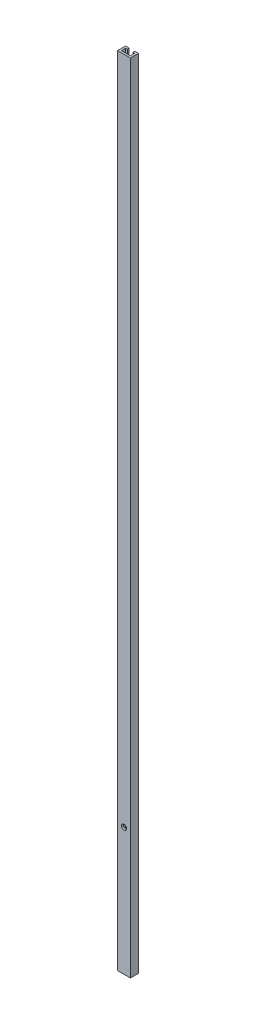
ISO-10303-21;
HEADER;
FILE_DESCRIPTION(('STEP AP214'),'2;1');
FILE_NAME('part.step','',(''),(''),'','','');
FILE_SCHEMA(('AUTOMOTIVE_DESIGN { 1 0 10303 214 1 1 1 1 }'));
ENDSEC;
DATA;
#1=APPLICATION_CONTEXT('core data for automotive mechanical design processes');
#2=APPLICATION_PROTOCOL_DEFINITION('international standard','automotive_design',2000,#1);
#3=PRODUCT_CONTEXT('',#1,'mechanical');
#4=PRODUCT('Part','Part','',(#3));
#5=PRODUCT_RELATED_PRODUCT_CATEGORY('part','',(#4));
#6=PRODUCT_DEFINITION_FORMATION('','',#4);
#7=PRODUCT_DEFINITION_CONTEXT('part definition',#1,'design');
#8=PRODUCT_DEFINITION('design','',#6,#7);
#9=PRODUCT_DEFINITION_SHAPE('','',#8);
#10=(LENGTH_UNIT() NAMED_UNIT(*) SI_UNIT(.MILLI.,.METRE.));
#11=(NAMED_UNIT(*) PLANE_ANGLE_UNIT() SI_UNIT($,.RADIAN.));
#12=(NAMED_UNIT(*) SI_UNIT($,.STERADIAN.) SOLID_ANGLE_UNIT());
#13=UNCERTAINTY_MEASURE_WITH_UNIT(LENGTH_MEASURE(1.E-05),#10,'distance_accuracy_value','');
#14=(GEOMETRIC_REPRESENTATION_CONTEXT(3) GLOBAL_UNCERTAINTY_ASSIGNED_CONTEXT((#13)) GLOBAL_UNIT_ASSIGNED_CONTEXT((#10,
#11,#12)) REPRESENTATION_CONTEXT('',''));
#15=CARTESIAN_POINT('',(0.,0.,0.));
#16=DIRECTION('',(0.,0.,1.));
#17=DIRECTION('',(1.,0.,0.));
#18=AXIS2_PLACEMENT_3D('',#15,#16,#17);
#19=CARTESIAN_POINT('',(0.,500.,0.));
#20=DIRECTION('',(1.,0.,0.));
#21=DIRECTION('',(0.,0.,-1.));
#22=AXIS2_PLACEMENT_3D('',#19,#20,#21);
#23=PLANE('',#22);
#24=DIRECTION('',(0.,0.,1.));
#25=VECTOR('',#24,1.);
#26=CARTESIAN_POINT('',(0.,0.,0.));
#27=LINE('',#26,#25);
#28=CARTESIAN_POINT('',(0.,0.,0.));
#29=VERTEX_POINT('',#28);
#30=CARTESIAN_POINT('',(0.,0.,5.));
#31=VERTEX_POINT('',#30);
#32=EDGE_CURVE('E156',#29,#31,#27,.T.);
#33=ORIENTED_EDGE('',*,*,#32,.T.);
#34=DIRECTION('',(0.,-1.,0.));
#35=VECTOR('',#34,1.);
#36=CARTESIAN_POINT('',(0.,500.,5.));
#37=LINE('',#36,#35);
#38=CARTESIAN_POINT('',(0.,500.,5.));
#39=VERTEX_POINT('',#38);
#40=EDGE_CURVE('E11',#39,#31,#37,.T.);
#41=ORIENTED_EDGE('',*,*,#40,.F.);
#42=DIRECTION('',(0.,0.,1.));
#43=VECTOR('',#42,1.);
#44=CARTESIAN_POINT('',(0.,500.,0.));
#45=LINE('',#44,#43);
#46=CARTESIAN_POINT('',(0.,500.,0.));
#47=VERTEX_POINT('',#46);
#48=EDGE_CURVE('E179',#47,#39,#45,.T.);
#49=ORIENTED_EDGE('',*,*,#48,.F.);
#50=DIRECTION('',(0.,-1.,0.));
#51=VECTOR('',#50,1.);
#52=CARTESIAN_POINT('',(0.,500.,0.));
#53=LINE('',#52,#51);
#54=EDGE_CURVE('E152',#47,#29,#53,.T.);
#55=ORIENTED_EDGE('',*,*,#54,.T.);
#56=EDGE_LOOP('',(#33,#41,#49,#55));
#57=FACE_BOUND('',#56,.T.);
#58=ADVANCED_FACE('F36',(#57),#23,.F.);
#59=CARTESIAN_POINT('',(0.,500.,5.));
#60=DIRECTION('',(0.,0.,-1.));
#61=DIRECTION('',(-1.,0.,0.));
#62=AXIS2_PLACEMENT_3D('',#59,#60,#61);
#63=PLANE('',#62);
#64=CARTESIAN_POINT('',(3.99999999999999,80.,5.));
#65=DIRECTION('',(0.,0.,1.));
#66=DIRECTION('',(1.,0.,0.));
#67=AXIS2_PLACEMENT_3D('',#64,#65,#66);
#68=CIRCLE('',#67,1.60000000000001);
#69=CARTESIAN_POINT('',(5.6,80.,5.));
#70=VERTEX_POINT('',#69);
#71=EDGE_CURVE('E343',#70,#70,#68,.T.);
#72=ORIENTED_EDGE('',*,*,#71,.F.);
#73=EDGE_LOOP('',(#72));
#74=FACE_BOUND('',#73,.T.);
#75=DIRECTION('',(1.,0.,0.));
#76=VECTOR('',#75,1.);
#77=CARTESIAN_POINT('',(0.,0.,5.));
#78=LINE('',#77,#76);
#79=CARTESIAN_POINT('',(8.,0.,5.));
#80=VERTEX_POINT('',#79);
#81=EDGE_CURVE('E159',#31,#80,#78,.T.);
#82=ORIENTED_EDGE('',*,*,#81,.T.);
#83=DIRECTION('',(0.,-1.,0.));
#84=VECTOR('',#83,1.);
#85=CARTESIAN_POINT('',(8.,500.,5.));
#86=LINE('',#85,#84);
#87=CARTESIAN_POINT('',(8.,500.,5.));
#88=VERTEX_POINT('',#87);
#89=EDGE_CURVE('E44',#88,#80,#86,.T.);
#90=ORIENTED_EDGE('',*,*,#89,.F.);
#91=DIRECTION('',(1.,0.,0.));
#92=VECTOR('',#91,1.);
#93=CARTESIAN_POINT('',(0.,500.,5.));
#94=LINE('',#93,#92);
#95=EDGE_CURVE('E107',#39,#88,#94,.T.);
#96=ORIENTED_EDGE('',*,*,#95,.F.);
#97=ORIENTED_EDGE('',*,*,#40,.T.);
#98=EDGE_LOOP('',(#82,#90,#96,#97));
#99=FACE_BOUND('',#98,.T.);
#100=ADVANCED_FACE('F257',(#74,#99),#63,.F.);
#101=CARTESIAN_POINT('',(8.,500.,5.));
#102=DIRECTION('',(-1.,0.,0.));
#103=DIRECTION('',(0.,0.,1.));
#104=AXIS2_PLACEMENT_3D('',#101,#102,#103);
#105=PLANE('',#104);
#106=DIRECTION('',(0.,0.,-1.));
#107=VECTOR('',#106,1.);
#108=CARTESIAN_POINT('',(8.,0.,5.));
#109=LINE('',#108,#107);
#110=CARTESIAN_POINT('',(8.,0.,0.));
#111=VERTEX_POINT('',#110);
#112=EDGE_CURVE('E162',#80,#111,#109,.T.);
#113=ORIENTED_EDGE('',*,*,#112,.T.);
#114=DIRECTION('',(0.,-1.,0.));
#115=VECTOR('',#114,1.);
#116=CARTESIAN_POINT('',(8.,500.,0.));
#117=LINE('',#116,#115);
#118=CARTESIAN_POINT('',(8.,500.,0.));
#119=VERTEX_POINT('',#118);
#120=EDGE_CURVE('E198',#119,#111,#117,.T.);
#121=ORIENTED_EDGE('',*,*,#120,.F.);
#122=DIRECTION('',(0.,0.,-1.));
#123=VECTOR('',#122,1.);
#124=CARTESIAN_POINT('',(8.,500.,5.));
#125=LINE('',#124,#123);
#126=EDGE_CURVE('E206',#88,#119,#125,.T.);
#127=ORIENTED_EDGE('',*,*,#126,.F.);
#128=ORIENTED_EDGE('',*,*,#89,.T.);
#129=EDGE_LOOP('',(#113,#121,#127,#128));
#130=FACE_BOUND('',#129,.T.);
#131=ADVANCED_FACE('F204',(#130),#105,.F.);
#132=CARTESIAN_POINT('',(8.,500.,0.));
#133=DIRECTION('',(0.,0.,1.));
#134=DIRECTION('',(1.,0.,0.));
#135=AXIS2_PLACEMENT_3D('',#132,#133,#134);
#136=PLANE('',#135);
#137=DIRECTION('',(-1.,0.,0.));
#138=VECTOR('',#137,1.);
#139=CARTESIAN_POINT('',(8.,0.,0.));
#140=LINE('',#139,#138);
#141=CARTESIAN_POINT('',(5.75,0.,0.));
#142=VERTEX_POINT('',#141);
#143=EDGE_CURVE('E164',#111,#142,#140,.T.);
#144=ORIENTED_EDGE('',*,*,#143,.T.);
#145=DIRECTION('',(0.,-1.,0.));
#146=VECTOR('',#145,1.);
#147=CARTESIAN_POINT('',(5.75,500.,0.));
#148=LINE('',#147,#146);
#149=CARTESIAN_POINT('',(5.75,500.,0.));
#150=VERTEX_POINT('',#149);
#151=EDGE_CURVE('E195',#150,#142,#148,.T.);
#152=ORIENTED_EDGE('',*,*,#151,.F.);
#153=DIRECTION('',(-1.,0.,0.));
#154=VECTOR('',#153,1.);
#155=CARTESIAN_POINT('',(8.,500.,0.));
#156=LINE('',#155,#154);
#157=EDGE_CURVE('E224',#119,#150,#156,.T.);
#158=ORIENTED_EDGE('',*,*,#157,.F.);
#159=ORIENTED_EDGE('',*,*,#120,.T.);
#160=EDGE_LOOP('',(#144,#152,#158,#159));
#161=FACE_BOUND('',#160,.T.);
#162=ADVANCED_FACE('F215',(#161),#136,.F.);
#163=CARTESIAN_POINT('',(5.75,500.,0.));
#164=DIRECTION('',(1.,0.,0.));
#165=DIRECTION('',(0.,0.,-1.));
#166=AXIS2_PLACEMENT_3D('',#163,#164,#165);
#167=PLANE('',#166);
#168=DIRECTION('',(0.,0.,1.));
#169=VECTOR('',#168,1.);
#170=CARTESIAN_POINT('',(5.75,0.,0.));
#171=LINE('',#170,#169);
#172=CARTESIAN_POINT('',(5.75,0.,1.15));
#173=VERTEX_POINT('',#172);
#174=EDGE_CURVE('E166',#142,#173,#171,.T.);
#175=ORIENTED_EDGE('',*,*,#174,.T.);
#176=DIRECTION('',(0.,-1.,0.));
#177=VECTOR('',#176,1.);
#178=CARTESIAN_POINT('',(5.75,500.,1.15));
#179=LINE('',#178,#177);
#180=CARTESIAN_POINT('',(5.75,500.,1.15));
#181=VERTEX_POINT('',#180);
#182=EDGE_CURVE('E192',#181,#173,#179,.T.);
#183=ORIENTED_EDGE('',*,*,#182,.F.);
#184=DIRECTION('',(0.,0.,1.));
#185=VECTOR('',#184,1.);
#186=CARTESIAN_POINT('',(5.75,500.,0.));
#187=LINE('',#186,#185);
#188=EDGE_CURVE('E221',#150,#181,#187,.T.);
#189=ORIENTED_EDGE('',*,*,#188,.F.);
#190=ORIENTED_EDGE('',*,*,#151,.T.);
#191=EDGE_LOOP('',(#175,#183,#189,#190));
#192=FACE_BOUND('',#191,.T.);
#193=ADVANCED_FACE('F219',(#192),#167,.F.);
#194=CARTESIAN_POINT('',(5.75,500.,1.15));
#195=DIRECTION('',(0.,0.,-1.));
#196=DIRECTION('',(-1.,0.,0.));
#197=AXIS2_PLACEMENT_3D('',#194,#195,#196);
#198=PLANE('',#197);
#199=DIRECTION('',(1.,0.,0.));
#200=VECTOR('',#199,1.);
#201=CARTESIAN_POINT('',(5.75,0.,1.15));
#202=LINE('',#201,#200);
#203=CARTESIAN_POINT('',(6.85,0.,1.15));
#204=VERTEX_POINT('',#203);
#205=EDGE_CURVE('E168',#173,#204,#202,.T.);
#206=ORIENTED_EDGE('',*,*,#205,.T.);
#207=DIRECTION('',(0.,-1.,0.));
#208=VECTOR('',#207,1.);
#209=CARTESIAN_POINT('',(6.85,500.,1.15));
#210=LINE('',#209,#208);
#211=CARTESIAN_POINT('',(6.85,500.,1.15));
#212=VERTEX_POINT('',#211);
#213=EDGE_CURVE('E189',#212,#204,#210,.T.);
#214=ORIENTED_EDGE('',*,*,#213,.F.);
#215=DIRECTION('',(1.,0.,0.));
#216=VECTOR('',#215,1.);
#217=CARTESIAN_POINT('',(5.75,500.,1.15));
#218=LINE('',#217,#216);
#219=EDGE_CURVE('E223',#181,#212,#218,.T.);
#220=ORIENTED_EDGE('',*,*,#219,.F.);
#221=ORIENTED_EDGE('',*,*,#182,.T.);
#222=EDGE_LOOP('',(#206,#214,#220,#221));
#223=FACE_BOUND('',#222,.T.);
#224=ADVANCED_FACE('F272',(#223),#198,.F.);
#225=CARTESIAN_POINT('',(6.85,500.,1.15));
#226=DIRECTION('',(1.,0.,0.));
#227=DIRECTION('',(0.,0.,-1.));
#228=AXIS2_PLACEMENT_3D('',#225,#226,#227);
#229=PLANE('',#228);
#230=DIRECTION('',(0.,0.,1.));
#231=VECTOR('',#230,1.);
#232=CARTESIAN_POINT('',(6.85,0.,1.15));
#233=LINE('',#232,#231);
#234=CARTESIAN_POINT('',(6.85,0.,3.85));
#235=VERTEX_POINT('',#234);
#236=EDGE_CURVE('E170',#204,#235,#233,.T.);
#237=ORIENTED_EDGE('',*,*,#236,.T.);
#238=DIRECTION('',(0.,-1.,0.));
#239=VECTOR('',#238,1.);
#240=CARTESIAN_POINT('',(6.85,500.,3.85));
#241=LINE('',#240,#239);
#242=CARTESIAN_POINT('',(6.85,500.,3.85));
#243=VERTEX_POINT('',#242);
#244=EDGE_CURVE('E186',#243,#235,#241,.T.);
#245=ORIENTED_EDGE('',*,*,#244,.F.);
#246=DIRECTION('',(0.,0.,1.));
#247=VECTOR('',#246,1.);
#248=CARTESIAN_POINT('',(6.85,500.,1.15));
#249=LINE('',#248,#247);
#250=EDGE_CURVE('E226',#212,#243,#249,.T.);
#251=ORIENTED_EDGE('',*,*,#250,.F.);
#252=ORIENTED_EDGE('',*,*,#213,.T.);
#253=EDGE_LOOP('',(#237,#245,#251,#252));
#254=FACE_BOUND('',#253,.T.);
#255=ADVANCED_FACE('F275',(#254),#229,.F.);
#256=CARTESIAN_POINT('',(6.85,500.,3.85));
#257=DIRECTION('',(0.,0.,1.));
#258=DIRECTION('',(1.,0.,0.));
#259=AXIS2_PLACEMENT_3D('',#256,#257,#258);
#260=PLANE('',#259);
#261=CARTESIAN_POINT('',(3.99999999999999,80.,3.85));
#262=DIRECTION('',(0.,0.,1.));
#263=DIRECTION('',(1.,0.,0.));
#264=AXIS2_PLACEMENT_3D('',#261,#262,#263);
#265=CIRCLE('',#264,1.60000000000001);
#266=CARTESIAN_POINT('',(5.6,80.,3.85));
#267=VERTEX_POINT('',#266);
#268=EDGE_CURVE('E160',#267,#267,#265,.F.);
#269=ORIENTED_EDGE('',*,*,#268,.F.);
#270=EDGE_LOOP('',(#269));
#271=FACE_BOUND('',#270,.T.);
#272=DIRECTION('',(-1.,0.,0.));
#273=VECTOR('',#272,1.);
#274=CARTESIAN_POINT('',(6.85,0.,3.85));
#275=LINE('',#274,#273);
#276=CARTESIAN_POINT('',(1.15,0.,3.85));
#277=VERTEX_POINT('',#276);
#278=EDGE_CURVE('E172',#235,#277,#275,.T.);
#279=ORIENTED_EDGE('',*,*,#278,.T.);
#280=DIRECTION('',(0.,-1.,0.));
#281=VECTOR('',#280,1.);
#282=CARTESIAN_POINT('',(1.15,500.,3.85));
#283=LINE('',#282,#281);
#284=CARTESIAN_POINT('',(1.15,500.,3.85));
#285=VERTEX_POINT('',#284);
#286=EDGE_CURVE('E183',#285,#277,#283,.T.);
#287=ORIENTED_EDGE('',*,*,#286,.F.);
#288=DIRECTION('',(-1.,0.,0.));
#289=VECTOR('',#288,1.);
#290=CARTESIAN_POINT('',(6.85,500.,3.85));
#291=LINE('',#290,#289);
#292=EDGE_CURVE('E232',#243,#285,#291,.T.);
#293=ORIENTED_EDGE('',*,*,#292,.F.);
#294=ORIENTED_EDGE('',*,*,#244,.T.);
#295=EDGE_LOOP('',(#279,#287,#293,#294));
#296=FACE_BOUND('',#295,.T.);
#297=ADVANCED_FACE('F238',(#271,#296),#260,.F.);
#298=CARTESIAN_POINT('',(1.15,500.,3.85));
#299=DIRECTION('',(-1.,0.,0.));
#300=DIRECTION('',(0.,0.,1.));
#301=AXIS2_PLACEMENT_3D('',#298,#299,#300);
#302=PLANE('',#301);
#303=DIRECTION('',(0.,0.,-1.));
#304=VECTOR('',#303,1.);
#305=CARTESIAN_POINT('',(1.15,0.,3.85));
#306=LINE('',#305,#304);
#307=CARTESIAN_POINT('',(1.15,0.,1.15));
#308=VERTEX_POINT('',#307);
#309=EDGE_CURVE('E174',#277,#308,#306,.T.);
#310=ORIENTED_EDGE('',*,*,#309,.T.);
#311=DIRECTION('',(0.,-1.,0.));
#312=VECTOR('',#311,1.);
#313=CARTESIAN_POINT('',(1.15,500.,1.15));
#314=LINE('',#313,#312);
#315=CARTESIAN_POINT('',(1.15,500.,1.15));
#316=VERTEX_POINT('',#315);
#317=EDGE_CURVE('E147',#316,#308,#314,.T.);
#318=ORIENTED_EDGE('',*,*,#317,.F.);
#319=DIRECTION('',(0.,0.,-1.));
#320=VECTOR('',#319,1.);
#321=CARTESIAN_POINT('',(1.15,500.,3.85));
#322=LINE('',#321,#320);
#323=EDGE_CURVE('E138',#285,#316,#322,.T.);
#324=ORIENTED_EDGE('',*,*,#323,.F.);
#325=ORIENTED_EDGE('',*,*,#286,.T.);
#326=EDGE_LOOP('',(#310,#318,#324,#325));
#327=FACE_BOUND('',#326,.T.);
#328=ADVANCED_FACE('F242',(#327),#302,.F.);
#329=CARTESIAN_POINT('',(1.15,500.,1.15));
#330=DIRECTION('',(0.,0.,-1.));
#331=DIRECTION('',(-1.,0.,0.));
#332=AXIS2_PLACEMENT_3D('',#329,#330,#331);
#333=PLANE('',#332);
#334=DIRECTION('',(1.,0.,0.));
#335=VECTOR('',#334,1.);
#336=CARTESIAN_POINT('',(1.15,0.,1.15));
#337=LINE('',#336,#335);
#338=CARTESIAN_POINT('',(2.25,0.,1.15));
#339=VERTEX_POINT('',#338);
#340=EDGE_CURVE('E146',#308,#339,#337,.T.);
#341=ORIENTED_EDGE('',*,*,#340,.T.);
#342=DIRECTION('',(0.,-1.,0.));
#343=VECTOR('',#342,1.);
#344=CARTESIAN_POINT('',(2.25,500.,1.15));
#345=LINE('',#344,#343);
#346=CARTESIAN_POINT('',(2.25,500.,1.15));
#347=VERTEX_POINT('',#346);
#348=EDGE_CURVE('E143',#347,#339,#345,.T.);
#349=ORIENTED_EDGE('',*,*,#348,.F.);
#350=DIRECTION('',(1.,0.,0.));
#351=VECTOR('',#350,1.);
#352=CARTESIAN_POINT('',(1.15,500.,1.15));
#353=LINE('',#352,#351);
#354=EDGE_CURVE('E132',#316,#347,#353,.T.);
#355=ORIENTED_EDGE('',*,*,#354,.F.);
#356=ORIENTED_EDGE('',*,*,#317,.T.);
#357=EDGE_LOOP('',(#341,#349,#355,#356));
#358=FACE_BOUND('',#357,.T.);
#359=ADVANCED_FACE('F144',(#358),#333,.F.);
#360=CARTESIAN_POINT('',(2.25,500.,1.15));
#361=DIRECTION('',(-1.,0.,0.));
#362=DIRECTION('',(0.,0.,1.));
#363=AXIS2_PLACEMENT_3D('',#360,#361,#362);
#364=PLANE('',#363);
#365=DIRECTION('',(0.,0.,-1.));
#366=VECTOR('',#365,1.);
#367=CARTESIAN_POINT('',(2.25,0.,1.15));
#368=LINE('',#367,#366);
#369=CARTESIAN_POINT('',(2.25,0.,0.));
#370=VERTEX_POINT('',#369);
#371=EDGE_CURVE('E93',#339,#370,#368,.T.);
#372=ORIENTED_EDGE('',*,*,#371,.T.);
#373=DIRECTION('',(0.,-1.,0.));
#374=VECTOR('',#373,1.);
#375=CARTESIAN_POINT('',(2.25,500.,0.));
#376=LINE('',#375,#374);
#377=CARTESIAN_POINT('',(2.25,500.,0.));
#378=VERTEX_POINT('',#377);
#379=EDGE_CURVE('E148',#378,#370,#376,.T.);
#380=ORIENTED_EDGE('',*,*,#379,.F.);
#381=DIRECTION('',(0.,0.,-1.));
#382=VECTOR('',#381,1.);
#383=CARTESIAN_POINT('',(2.25,500.,1.15));
#384=LINE('',#383,#382);
#385=EDGE_CURVE('E136',#347,#378,#384,.T.);
#386=ORIENTED_EDGE('',*,*,#385,.F.);
#387=ORIENTED_EDGE('',*,*,#348,.T.);
#388=EDGE_LOOP('',(#372,#380,#386,#387));
#389=FACE_BOUND('',#388,.T.);
#390=ADVANCED_FACE('F150',(#389),#364,.F.);
#391=CARTESIAN_POINT('',(2.25,500.,0.));
#392=DIRECTION('',(0.,0.,1.));
#393=DIRECTION('',(1.,0.,0.));
#394=AXIS2_PLACEMENT_3D('',#391,#392,#393);
#395=PLANE('',#394);
#396=DIRECTION('',(-1.,0.,0.));
#397=VECTOR('',#396,1.);
#398=CARTESIAN_POINT('',(2.25,0.,0.));
#399=LINE('',#398,#397);
#400=EDGE_CURVE('E99',#370,#29,#399,.T.);
#401=ORIENTED_EDGE('',*,*,#400,.T.);
#402=ORIENTED_EDGE('',*,*,#54,.F.);
#403=DIRECTION('',(-1.,0.,0.));
#404=VECTOR('',#403,1.);
#405=CARTESIAN_POINT('',(2.25,500.,0.));
#406=LINE('',#405,#404);
#407=EDGE_CURVE('E52',#378,#47,#406,.T.);
#408=ORIENTED_EDGE('',*,*,#407,.F.);
#409=ORIENTED_EDGE('',*,*,#379,.T.);
#410=EDGE_LOOP('',(#401,#402,#408,#409));
#411=FACE_BOUND('',#410,.T.);
#412=ADVANCED_FACE('F246',(#411),#395,.F.);
#413=CARTESIAN_POINT('',(0.,500.,0.));
#414=DIRECTION('',(0.,1.,0.));
#415=DIRECTION('',(0.,0.,1.));
#416=AXIS2_PLACEMENT_3D('',#413,#414,#415);
#417=PLANE('',#416);
#418=ORIENTED_EDGE('',*,*,#48,.T.);
#419=ORIENTED_EDGE('',*,*,#95,.T.);
#420=ORIENTED_EDGE('',*,*,#126,.T.);
#421=ORIENTED_EDGE('',*,*,#157,.T.);
#422=ORIENTED_EDGE('',*,*,#188,.T.);
#423=ORIENTED_EDGE('',*,*,#219,.T.);
#424=ORIENTED_EDGE('',*,*,#250,.T.);
#425=ORIENTED_EDGE('',*,*,#292,.T.);
#426=ORIENTED_EDGE('',*,*,#323,.T.);
#427=ORIENTED_EDGE('',*,*,#354,.T.);
#428=ORIENTED_EDGE('',*,*,#385,.T.);
#429=ORIENTED_EDGE('',*,*,#407,.T.);
#430=EDGE_LOOP('',(#418,#419,#420,#421,#422,#423,#424,#425,#426,#427,#428,#429));
#431=FACE_BOUND('',#430,.T.);
#432=ADVANCED_FACE('F134',(#431),#417,.T.);
#433=CARTESIAN_POINT('',(0.,0.,0.));
#434=DIRECTION('',(0.,1.,0.));
#435=DIRECTION('',(0.,0.,1.));
#436=AXIS2_PLACEMENT_3D('',#433,#434,#435);
#437=PLANE('',#436);
#438=ORIENTED_EDGE('',*,*,#32,.F.);
#439=ORIENTED_EDGE('',*,*,#400,.F.);
#440=ORIENTED_EDGE('',*,*,#371,.F.);
#441=ORIENTED_EDGE('',*,*,#340,.F.);
#442=ORIENTED_EDGE('',*,*,#309,.F.);
#443=ORIENTED_EDGE('',*,*,#278,.F.);
#444=ORIENTED_EDGE('',*,*,#236,.F.);
#445=ORIENTED_EDGE('',*,*,#205,.F.);
#446=ORIENTED_EDGE('',*,*,#174,.F.);
#447=ORIENTED_EDGE('',*,*,#143,.F.);
#448=ORIENTED_EDGE('',*,*,#112,.F.);
#449=ORIENTED_EDGE('',*,*,#81,.F.);
#450=EDGE_LOOP('',(#438,#439,#440,#441,#442,#443,#444,#445,#446,#447,#448,#449));
#451=FACE_BOUND('',#450,.T.);
#452=ADVANCED_FACE('F210',(#451),#437,.F.);
#453=CARTESIAN_POINT('',(3.99999999999999,80.,-0.675483399593917));
#454=DIRECTION('',(0.,0.,1.));
#455=DIRECTION('',(1.,0.,0.));
#456=AXIS2_PLACEMENT_3D('',#453,#454,#455);
#457=CYLINDRICAL_SURFACE('',#456,1.60000000000001);
#458=CARTESIAN_POINT('',(5.6,80.,3.85));
#459=CARTESIAN_POINT('',(5.6,80.,3.86197916666667));
#460=CARTESIAN_POINT('',(5.6,80.,3.87395833333333));
#461=CARTESIAN_POINT('',(5.6,80.,3.89791666666667));
#462=CARTESIAN_POINT('',(5.6,80.,3.90989583333333));
#463=CARTESIAN_POINT('',(5.6,80.,3.93385416666667));
#464=CARTESIAN_POINT('',(5.6,80.,3.94583333333333));
#465=CARTESIAN_POINT('',(5.6,80.,3.96979166666667));
#466=CARTESIAN_POINT('',(5.6,80.,3.98177083333333));
#467=CARTESIAN_POINT('',(5.6,80.,4.00572916666667));
#468=CARTESIAN_POINT('',(5.6,80.,4.01770833333333));
#469=CARTESIAN_POINT('',(5.6,80.,4.04166666666667));
#470=CARTESIAN_POINT('',(5.6,80.,4.05364583333333));
#471=CARTESIAN_POINT('',(5.6,80.,4.07760416666667));
#472=CARTESIAN_POINT('',(5.6,80.,4.08958333333333));
#473=CARTESIAN_POINT('',(5.6,80.,4.11354166666667));
#474=CARTESIAN_POINT('',(5.6,80.,4.12552083333333));
#475=CARTESIAN_POINT('',(5.6,80.,4.14947916666667));
#476=CARTESIAN_POINT('',(5.6,80.,4.16145833333333));
#477=CARTESIAN_POINT('',(5.6,80.,4.18541666666667));
#478=CARTESIAN_POINT('',(5.6,80.,4.19739583333333));
#479=CARTESIAN_POINT('',(5.6,80.,4.22135416666667));
#480=CARTESIAN_POINT('',(5.6,80.,4.23333333333333));
#481=CARTESIAN_POINT('',(5.6,80.,4.25729166666667));
#482=CARTESIAN_POINT('',(5.6,80.,4.26927083333333));
#483=CARTESIAN_POINT('',(5.6,80.,4.29322916666667));
#484=CARTESIAN_POINT('',(5.6,80.,4.30520833333333));
#485=CARTESIAN_POINT('',(5.6,80.,4.32916666666667));
#486=CARTESIAN_POINT('',(5.6,80.,4.34114583333333));
#487=CARTESIAN_POINT('',(5.6,80.,4.36510416666667));
#488=CARTESIAN_POINT('',(5.6,80.,4.37708333333333));
#489=CARTESIAN_POINT('',(5.6,80.,4.40104166666667));
#490=CARTESIAN_POINT('',(5.6,80.,4.41302083333333));
#491=CARTESIAN_POINT('',(5.6,80.,4.43697916666667));
#492=CARTESIAN_POINT('',(5.6,80.,4.44895833333333));
#493=CARTESIAN_POINT('',(5.6,80.,4.47291666666667));
#494=CARTESIAN_POINT('',(5.6,80.,4.48489583333333));
#495=CARTESIAN_POINT('',(5.6,80.,4.50885416666667));
#496=CARTESIAN_POINT('',(5.6,80.,4.52083333333333));
#497=CARTESIAN_POINT('',(5.6,80.,4.54479166666667));
#498=CARTESIAN_POINT('',(5.6,80.,4.55677083333333));
#499=CARTESIAN_POINT('',(5.6,80.,4.58072916666667));
#500=CARTESIAN_POINT('',(5.6,80.,4.59270833333333));
#501=CARTESIAN_POINT('',(5.6,80.,4.61666666666667));
#502=CARTESIAN_POINT('',(5.6,80.,4.62864583333333));
#503=CARTESIAN_POINT('',(5.6,80.,4.65260416666667));
#504=CARTESIAN_POINT('',(5.6,80.,4.66458333333333));
#505=CARTESIAN_POINT('',(5.6,80.,4.68854166666667));
#506=CARTESIAN_POINT('',(5.6,80.,4.70052083333333));
#507=CARTESIAN_POINT('',(5.6,80.,4.72447916666667));
#508=CARTESIAN_POINT('',(5.6,80.,4.73645833333333));
#509=CARTESIAN_POINT('',(5.6,80.,4.76041666666667));
#510=CARTESIAN_POINT('',(5.6,80.,4.77239583333333));
#511=CARTESIAN_POINT('',(5.6,80.,4.79635416666667));
#512=CARTESIAN_POINT('',(5.6,80.,4.80833333333333));
#513=CARTESIAN_POINT('',(5.6,80.,4.83229166666667));
#514=CARTESIAN_POINT('',(5.6,80.,4.84427083333333));
#515=CARTESIAN_POINT('',(5.6,80.,4.86822916666667));
#516=CARTESIAN_POINT('',(5.6,80.,4.88020833333333));
#517=CARTESIAN_POINT('',(5.6,80.,4.90416666666667));
#518=CARTESIAN_POINT('',(5.6,80.,4.91614583333333));
#519=CARTESIAN_POINT('',(5.6,80.,4.94010416666667));
#520=CARTESIAN_POINT('',(5.6,80.,4.95208333333333));
#521=CARTESIAN_POINT('',(5.6,80.,4.97604166666667));
#522=CARTESIAN_POINT('',(5.6,80.,4.98802083333333));
#523=CARTESIAN_POINT('',(5.6,80.,5.));
#524=B_SPLINE_CURVE_WITH_KNOTS('',3,(#458,#459,#460,#461,#462,#463,#464,#465,#466,#467,#468,
#469,#470,#471,#472,#473,#474,#475,#476,#477,#478,#479,#480,#481,#482,#483,#484,#485,#486,#487,
#488,#489,#490,#491,#492,#493,#494,#495,#496,#497,#498,#499,#500,#501,#502,#503,#504,#505,#506,
#507,#508,#509,#510,#511,#512,#513,#514,#515,#516,#517,#518,#519,#520,#521,#522,#523),
.UNSPECIFIED.,.F.,.F.,(4,2,2,2,2,2,2,2,2,2,2,2,2,2,2,2,2,2,2,2,2,2,2,2,2,2,2,2,2,2,2,2,4),(0.,
0.0359374999999995,0.0718749999999999,0.1078125,0.14375,0.179687499999999,0.215625,0.2515625,
0.2875,0.323437499999999,0.359374999999999,0.3953125,0.431249999999999,0.467187499999999,
0.503124999999999,0.5390625,0.574999999999999,0.610937499999999,0.646874999999999,
0.682812499999999,0.718749999999999,0.754687499999998,0.790624999999999,0.826562499999999,
0.862499999999999,0.898437499999998,0.934374999999999,0.970312499999999,1.00625,1.0421875,
1.078125,1.1140625,1.15),.UNSPECIFIED.);
#525=EDGE_CURVE('BSEAM312',#267,#70,#524,.T.);
#526=ORIENTED_EDGE('',*,*,#268,.T.);
#527=ORIENTED_EDGE('',*,*,#71,.T.);
#528=ORIENTED_EDGE('',*,*,#525,.T.);
#529=ORIENTED_EDGE('',*,*,#525,.F.);
#530=EDGE_LOOP('',(#526,#528,#527,#529));
#531=FACE_BOUND('',#530,.T.);
#532=ADVANCED_FACE('F312',(#531),#457,.F.);
#533=CLOSED_SHELL('',(#58,#100,#131,#162,#193,#224,#255,#297,#328,#359,#390,#412,#432,#452,#532));
#534=MANIFOLD_SOLID_BREP('B2',#533);
#535=ADVANCED_BREP_SHAPE_REPRESENTATION('',(#18,#534),#14);
#536=SHAPE_DEFINITION_REPRESENTATION(#9,#535);
ENDSEC;
END-ISO-10303-21;
